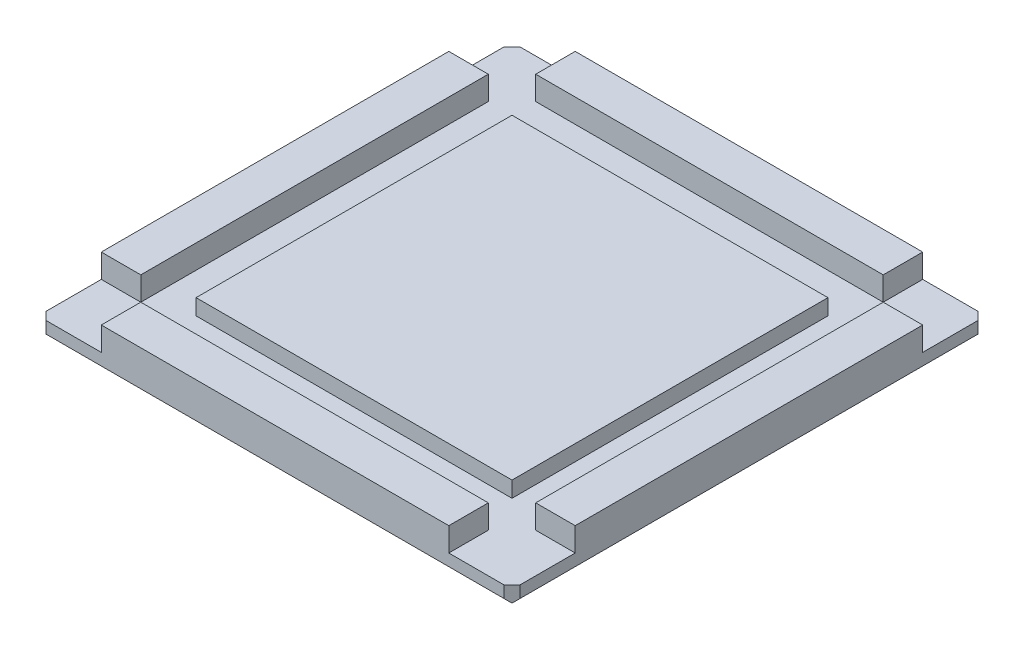
ISO-10303-21;
HEADER;
FILE_DESCRIPTION(('STEP AP214'),'2;1');
FILE_NAME('part.step','',(''),(''),'','','');
FILE_SCHEMA(('AUTOMOTIVE_DESIGN { 1 0 10303 214 1 1 1 1 }'));
ENDSEC;
DATA;
#1=APPLICATION_CONTEXT('core data for automotive mechanical design processes');
#2=APPLICATION_PROTOCOL_DEFINITION('international standard','automotive_design',2000,#1);
#3=PRODUCT_CONTEXT('',#1,'mechanical');
#4=PRODUCT('Part','Part','',(#3));
#5=PRODUCT_RELATED_PRODUCT_CATEGORY('part','',(#4));
#6=PRODUCT_DEFINITION_FORMATION('','',#4);
#7=PRODUCT_DEFINITION_CONTEXT('part definition',#1,'design');
#8=PRODUCT_DEFINITION('design','',#6,#7);
#9=PRODUCT_DEFINITION_SHAPE('','',#8);
#10=(LENGTH_UNIT() NAMED_UNIT(*) SI_UNIT(.MILLI.,.METRE.));
#11=(NAMED_UNIT(*) PLANE_ANGLE_UNIT() SI_UNIT($,.RADIAN.));
#12=(NAMED_UNIT(*) SI_UNIT($,.STERADIAN.) SOLID_ANGLE_UNIT());
#13=UNCERTAINTY_MEASURE_WITH_UNIT(LENGTH_MEASURE(1.E-05),#10,'distance_accuracy_value','');
#14=(GEOMETRIC_REPRESENTATION_CONTEXT(3) GLOBAL_UNCERTAINTY_ASSIGNED_CONTEXT((#13)) GLOBAL_UNIT_ASSIGNED_CONTEXT((#10,
#11,#12)) REPRESENTATION_CONTEXT('',''));
#15=CARTESIAN_POINT('',(0.,0.,0.));
#16=DIRECTION('',(0.,0.,1.));
#17=DIRECTION('',(1.,0.,0.));
#18=AXIS2_PLACEMENT_3D('',#15,#16,#17);
#19=CARTESIAN_POINT('',(0.,0.2,0.));
#20=DIRECTION('',(0.,1.,0.));
#21=DIRECTION('',(0.,0.,1.));
#22=AXIS2_PLACEMENT_3D('',#19,#20,#21);
#23=PLANE('',#22);
#24=DIRECTION('',(-1.,0.,0.));
#25=VECTOR('',#24,1.);
#26=CARTESIAN_POINT('',(-2.,0.2,-2.));
#27=LINE('',#26,#25);
#28=CARTESIAN_POINT('',(2.,0.2,-2.));
#29=VERTEX_POINT('',#28);
#30=CARTESIAN_POINT('',(-2.,0.2,-2.));
#31=VERTEX_POINT('',#30);
#32=EDGE_CURVE('E367',#29,#31,#27,.T.);
#33=ORIENTED_EDGE('',*,*,#32,.F.);
#34=DIRECTION('',(0.,0.,-1.));
#35=VECTOR('',#34,1.);
#36=CARTESIAN_POINT('',(2.,0.2,-2.));
#37=LINE('',#36,#35);
#38=CARTESIAN_POINT('',(2.,0.2,2.));
#39=VERTEX_POINT('',#38);
#40=EDGE_CURVE('E353',#39,#29,#37,.T.);
#41=ORIENTED_EDGE('',*,*,#40,.F.);
#42=DIRECTION('',(1.,0.,0.));
#43=VECTOR('',#42,1.);
#44=CARTESIAN_POINT('',(-2.,0.2,2.));
#45=LINE('',#44,#43);
#46=CARTESIAN_POINT('',(-2.,0.2,2.));
#47=VERTEX_POINT('',#46);
#48=EDGE_CURVE('E358',#47,#39,#45,.T.);
#49=ORIENTED_EDGE('',*,*,#48,.F.);
#50=DIRECTION('',(0.,0.,1.));
#51=VECTOR('',#50,1.);
#52=CARTESIAN_POINT('',(-2.,0.2,-2.));
#53=LINE('',#52,#51);
#54=EDGE_CURVE('E369',#31,#47,#53,.T.);
#55=ORIENTED_EDGE('',*,*,#54,.F.);
#56=EDGE_LOOP('',(#33,#41,#49,#55));
#57=FACE_BOUND('',#56,.T.);
#58=DIRECTION('',(1.,0.,0.));
#59=VECTOR('',#58,1.);
#60=CARTESIAN_POINT('',(-3.,0.2,3.));
#61=LINE('',#60,#59);
#62=CARTESIAN_POINT('',(2.2,0.2,3.));
#63=VERTEX_POINT('',#62);
#64=CARTESIAN_POINT('',(2.9,0.2,3.));
#65=VERTEX_POINT('',#64);
#66=EDGE_CURVE('E391',#63,#65,#61,.T.);
#67=ORIENTED_EDGE('',*,*,#66,.T.);
#68=DIRECTION('',(-0.707106781186548,0.,0.707106781186548));
#69=VECTOR('',#68,1.);
#70=CARTESIAN_POINT('',(2.95,0.2,2.95));
#71=LINE('',#70,#69);
#72=CARTESIAN_POINT('',(3.,0.2,2.9));
#73=VERTEX_POINT('',#72);
#74=EDGE_CURVE('E441',#65,#73,#71,.F.);
#75=ORIENTED_EDGE('',*,*,#74,.T.);
#76=DIRECTION('',(0.,0.,-1.));
#77=VECTOR('',#76,1.);
#78=CARTESIAN_POINT('',(3.,0.2,-3.));
#79=LINE('',#78,#77);
#80=CARTESIAN_POINT('',(3.,0.2,2.2));
#81=VERTEX_POINT('',#80);
#82=EDGE_CURVE('E383',#73,#81,#79,.T.);
#83=ORIENTED_EDGE('',*,*,#82,.T.);
#84=DIRECTION('',(1.,0.,0.));
#85=VECTOR('',#84,1.);
#86=CARTESIAN_POINT('',(3.,0.2,2.2));
#87=LINE('',#86,#85);
#88=CARTESIAN_POINT('',(2.5,0.2,2.2));
#89=VERTEX_POINT('',#88);
#90=EDGE_CURVE('E271',#89,#81,#87,.T.);
#91=ORIENTED_EDGE('',*,*,#90,.F.);
#92=DIRECTION('',(0.,0.,1.));
#93=VECTOR('',#92,1.);
#94=CARTESIAN_POINT('',(2.5,0.2,2.2));
#95=LINE('',#94,#93);
#96=CARTESIAN_POINT('',(2.5,0.2,-2.2));
#97=VERTEX_POINT('',#96);
#98=EDGE_CURVE('E261',#97,#89,#95,.T.);
#99=ORIENTED_EDGE('',*,*,#98,.F.);
#100=DIRECTION('',(-1.,0.,0.));
#101=VECTOR('',#100,1.);
#102=CARTESIAN_POINT('',(3.,0.2,-2.2));
#103=LINE('',#102,#101);
#104=CARTESIAN_POINT('',(3.,0.2,-2.2));
#105=VERTEX_POINT('',#104);
#106=EDGE_CURVE('E258',#105,#97,#103,.T.);
#107=ORIENTED_EDGE('',*,*,#106,.F.);
#108=CARTESIAN_POINT('',(3.,0.2,-2.9));
#109=VERTEX_POINT('',#108);
#110=EDGE_CURVE('E382',#105,#109,#79,.T.);
#111=ORIENTED_EDGE('',*,*,#110,.T.);
#112=DIRECTION('',(0.707106781186544,0.,0.707106781186551));
#113=VECTOR('',#112,1.);
#114=CARTESIAN_POINT('',(2.95000000000001,0.2,-2.94999999999999));
#115=LINE('',#114,#113);
#116=CARTESIAN_POINT('',(2.9,0.2,-3.));
#117=VERTEX_POINT('',#116);
#118=EDGE_CURVE('E439',#109,#117,#115,.F.);
#119=ORIENTED_EDGE('',*,*,#118,.T.);
#120=DIRECTION('',(-1.,0.,0.));
#121=VECTOR('',#120,1.);
#122=CARTESIAN_POINT('',(-3.,0.2,-3.));
#123=LINE('',#122,#121);
#124=CARTESIAN_POINT('',(2.2,0.2,-3.));
#125=VERTEX_POINT('',#124);
#126=EDGE_CURVE('E386',#117,#125,#123,.T.);
#127=ORIENTED_EDGE('',*,*,#126,.T.);
#128=DIRECTION('',(0.,0.,-1.));
#129=VECTOR('',#128,1.);
#130=CARTESIAN_POINT('',(2.2,0.2,-3.));
#131=LINE('',#130,#129);
#132=CARTESIAN_POINT('',(2.2,0.2,-2.5));
#133=VERTEX_POINT('',#132);
#134=EDGE_CURVE('E257',#133,#125,#131,.T.);
#135=ORIENTED_EDGE('',*,*,#134,.F.);
#136=DIRECTION('',(1.,0.,0.));
#137=VECTOR('',#136,1.);
#138=CARTESIAN_POINT('',(2.2,0.2,-2.5));
#139=LINE('',#138,#137);
#140=CARTESIAN_POINT('',(-2.2,0.2,-2.5));
#141=VERTEX_POINT('',#140);
#142=EDGE_CURVE('E254',#141,#133,#139,.T.);
#143=ORIENTED_EDGE('',*,*,#142,.F.);
#144=DIRECTION('',(0.,0.,1.));
#145=VECTOR('',#144,1.);
#146=CARTESIAN_POINT('',(-2.2,0.2,-3.));
#147=LINE('',#146,#145);
#148=CARTESIAN_POINT('',(-2.2,0.2,-3.));
#149=VERTEX_POINT('',#148);
#150=EDGE_CURVE('E477',#149,#141,#147,.T.);
#151=ORIENTED_EDGE('',*,*,#150,.F.);
#152=CARTESIAN_POINT('',(-2.9,0.2,-3.));
#153=VERTEX_POINT('',#152);
#154=EDGE_CURVE('E385',#149,#153,#123,.T.);
#155=ORIENTED_EDGE('',*,*,#154,.T.);
#156=DIRECTION('',(0.707106781186551,0.,-0.707106781186544));
#157=VECTOR('',#156,1.);
#158=CARTESIAN_POINT('',(-2.94999999999999,0.2,-2.95000000000001));
#159=LINE('',#158,#157);
#160=CARTESIAN_POINT('',(-3.,0.2,-2.9));
#161=VERTEX_POINT('',#160);
#162=EDGE_CURVE('E437',#153,#161,#159,.F.);
#163=ORIENTED_EDGE('',*,*,#162,.T.);
#164=DIRECTION('',(0.,0.,1.));
#165=VECTOR('',#164,1.);
#166=CARTESIAN_POINT('',(-3.,0.2,-3.));
#167=LINE('',#166,#165);
#168=CARTESIAN_POINT('',(-3.,0.2,-2.2));
#169=VERTEX_POINT('',#168);
#170=EDGE_CURVE('E389',#161,#169,#167,.T.);
#171=ORIENTED_EDGE('',*,*,#170,.T.);
#172=DIRECTION('',(-1.,0.,0.));
#173=VECTOR('',#172,1.);
#174=CARTESIAN_POINT('',(-3.,0.2,-2.2));
#175=LINE('',#174,#173);
#176=CARTESIAN_POINT('',(-2.5,0.2,-2.2));
#177=VERTEX_POINT('',#176);
#178=EDGE_CURVE('E328',#177,#169,#175,.T.);
#179=ORIENTED_EDGE('',*,*,#178,.F.);
#180=DIRECTION('',(0.,0.,-1.));
#181=VECTOR('',#180,1.);
#182=CARTESIAN_POINT('',(-2.5,0.2,-2.2));
#183=LINE('',#182,#181);
#184=CARTESIAN_POINT('',(-2.5,0.2,2.2));
#185=VERTEX_POINT('',#184);
#186=EDGE_CURVE('E337',#185,#177,#183,.T.);
#187=ORIENTED_EDGE('',*,*,#186,.F.);
#188=DIRECTION('',(1.,0.,0.));
#189=VECTOR('',#188,1.);
#190=CARTESIAN_POINT('',(-3.,0.2,2.2));
#191=LINE('',#190,#189);
#192=CARTESIAN_POINT('',(-3.,0.2,2.2));
#193=VERTEX_POINT('',#192);
#194=EDGE_CURVE('E323',#193,#185,#191,.T.);
#195=ORIENTED_EDGE('',*,*,#194,.F.);
#196=CARTESIAN_POINT('',(-3.,0.2,2.9));
#197=VERTEX_POINT('',#196);
#198=EDGE_CURVE('E388',#193,#197,#167,.T.);
#199=ORIENTED_EDGE('',*,*,#198,.T.);
#200=DIRECTION('',(-0.707106781186544,0.,-0.707106781186551));
#201=VECTOR('',#200,1.);
#202=CARTESIAN_POINT('',(-2.95000000000001,0.2,2.94999999999999));
#203=LINE('',#202,#201);
#204=CARTESIAN_POINT('',(-2.9,0.2,3.));
#205=VERTEX_POINT('',#204);
#206=EDGE_CURVE('E435',#197,#205,#203,.F.);
#207=ORIENTED_EDGE('',*,*,#206,.T.);
#208=CARTESIAN_POINT('',(-2.2,0.2,3.));
#209=VERTEX_POINT('',#208);
#210=EDGE_CURVE('E392',#205,#209,#61,.T.);
#211=ORIENTED_EDGE('',*,*,#210,.T.);
#212=DIRECTION('',(0.,0.,1.));
#213=VECTOR('',#212,1.);
#214=CARTESIAN_POINT('',(-2.2,0.2,3.));
#215=LINE('',#214,#213);
#216=CARTESIAN_POINT('',(-2.2,0.2,2.5));
#217=VERTEX_POINT('',#216);
#218=EDGE_CURVE('E293',#217,#209,#215,.T.);
#219=ORIENTED_EDGE('',*,*,#218,.F.);
#220=DIRECTION('',(-1.,0.,0.));
#221=VECTOR('',#220,1.);
#222=CARTESIAN_POINT('',(-2.2,0.2,2.5));
#223=LINE('',#222,#221);
#224=CARTESIAN_POINT('',(2.2,0.2,2.5));
#225=VERTEX_POINT('',#224);
#226=EDGE_CURVE('E298',#225,#217,#223,.T.);
#227=ORIENTED_EDGE('',*,*,#226,.F.);
#228=DIRECTION('',(0.,0.,-1.));
#229=VECTOR('',#228,1.);
#230=CARTESIAN_POINT('',(2.2,0.2,3.));
#231=LINE('',#230,#229);
#232=EDGE_CURVE('E307',#63,#225,#231,.T.);
#233=ORIENTED_EDGE('',*,*,#232,.F.);
#234=EDGE_LOOP('',(#67,#75,#83,#91,#99,#107,#111,#119,#127,#135,#143,#151,#155,#163,#171,#179,
#187,#195,#199,#207,#211,#219,#227,#233));
#235=FACE_BOUND('',#234,.T.);
#236=ADVANCED_FACE('F36',(#57,#235),#23,.T.);
#237=CARTESIAN_POINT('',(3.,0.2,-3.));
#238=DIRECTION('',(-1.,0.,0.));
#239=DIRECTION('',(0.,0.,1.));
#240=AXIS2_PLACEMENT_3D('',#237,#238,#239);
#241=PLANE('',#240);
#242=ORIENTED_EDGE('',*,*,#82,.F.);
#243=DIRECTION('',(0.,-1.,0.));
#244=VECTOR('',#243,1.);
#245=CARTESIAN_POINT('',(3.,0.2,2.9));
#246=LINE('',#245,#244);
#247=CARTESIAN_POINT('',(3.,0.0499999999999997,2.9));
#248=VERTEX_POINT('',#247);
#249=EDGE_CURVE('E419',#73,#248,#246,.T.);
#250=ORIENTED_EDGE('',*,*,#249,.T.);
#251=DIRECTION('',(0.,0.,-1.));
#252=VECTOR('',#251,1.);
#253=CARTESIAN_POINT('',(3.,0.0499999999999997,-3.));
#254=LINE('',#253,#252);
#255=CARTESIAN_POINT('',(3.,0.0499999999999997,-2.9));
#256=VERTEX_POINT('',#255);
#257=EDGE_CURVE('E414',#248,#256,#254,.T.);
#258=ORIENTED_EDGE('',*,*,#257,.T.);
#259=DIRECTION('',(0.,1.,0.));
#260=VECTOR('',#259,1.);
#261=CARTESIAN_POINT('',(3.,0.2,-2.9));
#262=LINE('',#261,#260);
#263=EDGE_CURVE('E417',#256,#109,#262,.T.);
#264=ORIENTED_EDGE('',*,*,#263,.T.);
#265=ORIENTED_EDGE('',*,*,#110,.F.);
#266=DIRECTION('',(0.,-1.,0.));
#267=VECTOR('',#266,1.);
#268=CARTESIAN_POINT('',(3.,0.5,-2.2));
#269=LINE('',#268,#267);
#270=CARTESIAN_POINT('',(3.,0.5,-2.2));
#271=VERTEX_POINT('',#270);
#272=EDGE_CURVE('E290',#271,#105,#269,.T.);
#273=ORIENTED_EDGE('',*,*,#272,.F.);
#274=DIRECTION('',(0.,0.,-1.));
#275=VECTOR('',#274,1.);
#276=CARTESIAN_POINT('',(3.,0.5,2.2));
#277=LINE('',#276,#275);
#278=CARTESIAN_POINT('',(3.,0.5,2.2));
#279=VERTEX_POINT('',#278);
#280=EDGE_CURVE('E267',#279,#271,#277,.T.);
#281=ORIENTED_EDGE('',*,*,#280,.F.);
#282=DIRECTION('',(0.,-1.,0.));
#283=VECTOR('',#282,1.);
#284=CARTESIAN_POINT('',(3.,0.5,2.2));
#285=LINE('',#284,#283);
#286=EDGE_CURVE('E276',#279,#81,#285,.T.);
#287=ORIENTED_EDGE('',*,*,#286,.T.);
#288=EDGE_LOOP('',(#242,#250,#258,#264,#265,#273,#281,#287));
#289=FACE_BOUND('',#288,.T.);
#290=ADVANCED_FACE('F502',(#289),#241,.F.);
#291=CARTESIAN_POINT('',(-3.,0.2,-3.));
#292=DIRECTION('',(0.,0.,1.));
#293=DIRECTION('',(1.,0.,0.));
#294=AXIS2_PLACEMENT_3D('',#291,#292,#293);
#295=PLANE('',#294);
#296=ORIENTED_EDGE('',*,*,#126,.F.);
#297=DIRECTION('',(0.,-1.,0.));
#298=VECTOR('',#297,1.);
#299=CARTESIAN_POINT('',(2.9,0.2,-3.));
#300=LINE('',#299,#298);
#301=CARTESIAN_POINT('',(2.9,0.0499999999999997,-3.));
#302=VERTEX_POINT('',#301);
#303=EDGE_CURVE('E445',#117,#302,#300,.T.);
#304=ORIENTED_EDGE('',*,*,#303,.T.);
#305=DIRECTION('',(-1.,0.,0.));
#306=VECTOR('',#305,1.);
#307=CARTESIAN_POINT('',(-3.,0.0499999999999997,-3.));
#308=LINE('',#307,#306);
#309=CARTESIAN_POINT('',(-2.9,0.0499999999999997,-3.));
#310=VERTEX_POINT('',#309);
#311=EDGE_CURVE('E394',#302,#310,#308,.T.);
#312=ORIENTED_EDGE('',*,*,#311,.T.);
#313=DIRECTION('',(0.,1.,0.));
#314=VECTOR('',#313,1.);
#315=CARTESIAN_POINT('',(-2.9,0.2,-3.));
#316=LINE('',#315,#314);
#317=EDGE_CURVE('E443',#310,#153,#316,.T.);
#318=ORIENTED_EDGE('',*,*,#317,.T.);
#319=ORIENTED_EDGE('',*,*,#154,.F.);
#320=DIRECTION('',(0.,-1.,0.));
#321=VECTOR('',#320,1.);
#322=CARTESIAN_POINT('',(-2.2,0.5,-3.));
#323=LINE('',#322,#321);
#324=CARTESIAN_POINT('',(-2.2,0.5,-3.));
#325=VERTEX_POINT('',#324);
#326=EDGE_CURVE('E241',#325,#149,#323,.T.);
#327=ORIENTED_EDGE('',*,*,#326,.F.);
#328=DIRECTION('',(-1.,0.,0.));
#329=VECTOR('',#328,1.);
#330=CARTESIAN_POINT('',(2.2,0.5,-3.));
#331=LINE('',#330,#329);
#332=CARTESIAN_POINT('',(2.2,0.5,-3.));
#333=VERTEX_POINT('',#332);
#334=EDGE_CURVE('E233',#333,#325,#331,.T.);
#335=ORIENTED_EDGE('',*,*,#334,.F.);
#336=DIRECTION('',(0.,-1.,0.));
#337=VECTOR('',#336,1.);
#338=CARTESIAN_POINT('',(2.2,0.5,-3.));
#339=LINE('',#338,#337);
#340=EDGE_CURVE('E238',#333,#125,#339,.T.);
#341=ORIENTED_EDGE('',*,*,#340,.T.);
#342=EDGE_LOOP('',(#296,#304,#312,#318,#319,#327,#335,#341));
#343=FACE_BOUND('',#342,.T.);
#344=ADVANCED_FACE('F236',(#343),#295,.F.);
#345=CARTESIAN_POINT('',(-3.,0.2,-3.));
#346=DIRECTION('',(1.,0.,0.));
#347=DIRECTION('',(0.,0.,-1.));
#348=AXIS2_PLACEMENT_3D('',#345,#346,#347);
#349=PLANE('',#348);
#350=ORIENTED_EDGE('',*,*,#170,.F.);
#351=DIRECTION('',(0.,-1.,0.));
#352=VECTOR('',#351,1.);
#353=CARTESIAN_POINT('',(-3.,0.2,-2.9));
#354=LINE('',#353,#352);
#355=CARTESIAN_POINT('',(-3.,0.0499999999999997,-2.9));
#356=VERTEX_POINT('',#355);
#357=EDGE_CURVE('E454',#161,#356,#354,.T.);
#358=ORIENTED_EDGE('',*,*,#357,.T.);
#359=DIRECTION('',(0.,0.,1.));
#360=VECTOR('',#359,1.);
#361=CARTESIAN_POINT('',(-3.,0.0499999999999997,-3.));
#362=LINE('',#361,#360);
#363=CARTESIAN_POINT('',(-3.,0.0499999999999997,2.9));
#364=VERTEX_POINT('',#363);
#365=EDGE_CURVE('E409',#356,#364,#362,.T.);
#366=ORIENTED_EDGE('',*,*,#365,.T.);
#367=DIRECTION('',(0.,1.,0.));
#368=VECTOR('',#367,1.);
#369=CARTESIAN_POINT('',(-3.,0.2,2.9));
#370=LINE('',#369,#368);
#371=EDGE_CURVE('E452',#364,#197,#370,.T.);
#372=ORIENTED_EDGE('',*,*,#371,.T.);
#373=ORIENTED_EDGE('',*,*,#198,.F.);
#374=DIRECTION('',(0.,-1.,0.));
#375=VECTOR('',#374,1.);
#376=CARTESIAN_POINT('',(-3.,0.5,2.2));
#377=LINE('',#376,#375);
#378=CARTESIAN_POINT('',(-3.,0.5,2.2));
#379=VERTEX_POINT('',#378);
#380=EDGE_CURVE('E350',#379,#193,#377,.T.);
#381=ORIENTED_EDGE('',*,*,#380,.F.);
#382=DIRECTION('',(0.,0.,1.));
#383=VECTOR('',#382,1.);
#384=CARTESIAN_POINT('',(-3.,0.5,-2.2));
#385=LINE('',#384,#383);
#386=CARTESIAN_POINT('',(-3.,0.5,-2.2));
#387=VERTEX_POINT('',#386);
#388=EDGE_CURVE('E324',#387,#379,#385,.T.);
#389=ORIENTED_EDGE('',*,*,#388,.F.);
#390=DIRECTION('',(0.,-1.,0.));
#391=VECTOR('',#390,1.);
#392=CARTESIAN_POINT('',(-3.,0.5,-2.2));
#393=LINE('',#392,#391);
#394=EDGE_CURVE('E334',#387,#169,#393,.T.);
#395=ORIENTED_EDGE('',*,*,#394,.T.);
#396=EDGE_LOOP('',(#350,#358,#366,#372,#373,#381,#389,#395));
#397=FACE_BOUND('',#396,.T.);
#398=ADVANCED_FACE('F457',(#397),#349,.F.);
#399=CARTESIAN_POINT('',(-3.,0.2,3.));
#400=DIRECTION('',(0.,0.,-1.));
#401=DIRECTION('',(-1.,0.,0.));
#402=AXIS2_PLACEMENT_3D('',#399,#400,#401);
#403=PLANE('',#402);
#404=DIRECTION('',(1.,0.,0.));
#405=VECTOR('',#404,1.);
#406=CARTESIAN_POINT('',(-3.,0.0499999999999997,3.));
#407=LINE('',#406,#405);
#408=CARTESIAN_POINT('',(-2.9,0.0499999999999997,3.));
#409=VERTEX_POINT('',#408);
#410=CARTESIAN_POINT('',(2.9,0.0499999999999997,3.));
#411=VERTEX_POINT('',#410);
#412=EDGE_CURVE('E411',#409,#411,#407,.T.);
#413=ORIENTED_EDGE('',*,*,#412,.T.);
#414=DIRECTION('',(0.,1.,0.));
#415=VECTOR('',#414,1.);
#416=CARTESIAN_POINT('',(2.9,0.2,3.));
#417=LINE('',#416,#415);
#418=EDGE_CURVE('E433',#411,#65,#417,.T.);
#419=ORIENTED_EDGE('',*,*,#418,.T.);
#420=ORIENTED_EDGE('',*,*,#66,.F.);
#421=DIRECTION('',(0.,-1.,0.));
#422=VECTOR('',#421,1.);
#423=CARTESIAN_POINT('',(2.2,0.5,3.));
#424=LINE('',#423,#422);
#425=CARTESIAN_POINT('',(2.2,0.5,3.));
#426=VERTEX_POINT('',#425);
#427=EDGE_CURVE('E317',#426,#63,#424,.T.);
#428=ORIENTED_EDGE('',*,*,#427,.F.);
#429=DIRECTION('',(1.,0.,0.));
#430=VECTOR('',#429,1.);
#431=CARTESIAN_POINT('',(-2.2,0.5,3.));
#432=LINE('',#431,#430);
#433=CARTESIAN_POINT('',(-2.2,0.5,3.));
#434=VERTEX_POINT('',#433);
#435=EDGE_CURVE('E297',#434,#426,#432,.T.);
#436=ORIENTED_EDGE('',*,*,#435,.F.);
#437=DIRECTION('',(0.,-1.,0.));
#438=VECTOR('',#437,1.);
#439=CARTESIAN_POINT('',(-2.2,0.5,3.));
#440=LINE('',#439,#438);
#441=EDGE_CURVE('E320',#434,#209,#440,.T.);
#442=ORIENTED_EDGE('',*,*,#441,.T.);
#443=ORIENTED_EDGE('',*,*,#210,.F.);
#444=DIRECTION('',(0.,-1.,0.));
#445=VECTOR('',#444,1.);
#446=CARTESIAN_POINT('',(-2.9,0.2,3.));
#447=LINE('',#446,#445);
#448=EDGE_CURVE('E430',#205,#409,#447,.T.);
#449=ORIENTED_EDGE('',*,*,#448,.T.);
#450=EDGE_LOOP('',(#413,#419,#420,#428,#436,#442,#443,#449));
#451=FACE_BOUND('',#450,.T.);
#452=ADVANCED_FACE('F517',(#451),#403,.F.);
#453=CARTESIAN_POINT('',(0.,0.,0.));
#454=DIRECTION('',(0.,1.,0.));
#455=DIRECTION('',(0.,0.,1.));
#456=AXIS2_PLACEMENT_3D('',#453,#454,#455);
#457=PLANE('',#456);
#458=DIRECTION('',(0.,0.,-1.));
#459=VECTOR('',#458,1.);
#460=CARTESIAN_POINT('',(-2.95,0.,0.));
#461=LINE('',#460,#459);
#462=CARTESIAN_POINT('',(-2.95,0.,2.95));
#463=VERTEX_POINT('',#462);
#464=CARTESIAN_POINT('',(-2.95,0.,-2.95));
#465=VERTEX_POINT('',#464);
#466=EDGE_CURVE('E403',#463,#465,#461,.T.);
#467=ORIENTED_EDGE('',*,*,#466,.T.);
#468=DIRECTION('',(1.,0.,0.));
#469=VECTOR('',#468,1.);
#470=CARTESIAN_POINT('',(0.,0.,-2.95));
#471=LINE('',#470,#469);
#472=CARTESIAN_POINT('',(2.95,0.,-2.95));
#473=VERTEX_POINT('',#472);
#474=EDGE_CURVE('E406',#465,#473,#471,.T.);
#475=ORIENTED_EDGE('',*,*,#474,.T.);
#476=DIRECTION('',(0.,0.,1.));
#477=VECTOR('',#476,1.);
#478=CARTESIAN_POINT('',(2.95,0.,0.));
#479=LINE('',#478,#477);
#480=CARTESIAN_POINT('',(2.95,0.,2.95));
#481=VERTEX_POINT('',#480);
#482=EDGE_CURVE('E397',#473,#481,#479,.T.);
#483=ORIENTED_EDGE('',*,*,#482,.T.);
#484=DIRECTION('',(-1.,0.,0.));
#485=VECTOR('',#484,1.);
#486=CARTESIAN_POINT('',(0.,0.,2.95));
#487=LINE('',#486,#485);
#488=EDGE_CURVE('E400',#481,#463,#487,.T.);
#489=ORIENTED_EDGE('',*,*,#488,.T.);
#490=EDGE_LOOP('',(#467,#475,#483,#489));
#491=FACE_BOUND('',#490,.T.);
#492=ADVANCED_FACE('F463',(#491),#457,.F.);
#493=CARTESIAN_POINT('',(2.,0.4,-2.));
#494=DIRECTION('',(-1.,0.,0.));
#495=DIRECTION('',(0.,0.,1.));
#496=AXIS2_PLACEMENT_3D('',#493,#494,#495);
#497=PLANE('',#496);
#498=ORIENTED_EDGE('',*,*,#40,.T.);
#499=DIRECTION('',(0.,-1.,0.));
#500=VECTOR('',#499,1.);
#501=CARTESIAN_POINT('',(2.,0.4,-2.));
#502=LINE('',#501,#500);
#503=CARTESIAN_POINT('',(2.,0.4,-2.));
#504=VERTEX_POINT('',#503);
#505=EDGE_CURVE('E380',#504,#29,#502,.T.);
#506=ORIENTED_EDGE('',*,*,#505,.F.);
#507=DIRECTION('',(0.,0.,-1.));
#508=VECTOR('',#507,1.);
#509=CARTESIAN_POINT('',(2.,0.4,-2.));
#510=LINE('',#509,#508);
#511=CARTESIAN_POINT('',(2.,0.4,2.));
#512=VERTEX_POINT('',#511);
#513=EDGE_CURVE('E354',#512,#504,#510,.T.);
#514=ORIENTED_EDGE('',*,*,#513,.F.);
#515=DIRECTION('',(0.,-1.,0.));
#516=VECTOR('',#515,1.);
#517=CARTESIAN_POINT('',(2.,0.4,2.));
#518=LINE('',#517,#516);
#519=EDGE_CURVE('E364',#512,#39,#518,.T.);
#520=ORIENTED_EDGE('',*,*,#519,.T.);
#521=EDGE_LOOP('',(#498,#506,#514,#520));
#522=FACE_BOUND('',#521,.T.);
#523=ADVANCED_FACE('F513',(#522),#497,.F.);
#524=CARTESIAN_POINT('',(-2.,0.4,-2.));
#525=DIRECTION('',(0.,0.,1.));
#526=DIRECTION('',(1.,0.,0.));
#527=AXIS2_PLACEMENT_3D('',#524,#525,#526);
#528=PLANE('',#527);
#529=ORIENTED_EDGE('',*,*,#32,.T.);
#530=DIRECTION('',(0.,-1.,0.));
#531=VECTOR('',#530,1.);
#532=CARTESIAN_POINT('',(-2.,0.4,-2.));
#533=LINE('',#532,#531);
#534=CARTESIAN_POINT('',(-2.,0.4,-2.));
#535=VERTEX_POINT('',#534);
#536=EDGE_CURVE('E377',#535,#31,#533,.T.);
#537=ORIENTED_EDGE('',*,*,#536,.F.);
#538=DIRECTION('',(-1.,0.,0.));
#539=VECTOR('',#538,1.);
#540=CARTESIAN_POINT('',(-2.,0.4,-2.));
#541=LINE('',#540,#539);
#542=EDGE_CURVE('E357',#504,#535,#541,.T.);
#543=ORIENTED_EDGE('',*,*,#542,.F.);
#544=ORIENTED_EDGE('',*,*,#505,.T.);
#545=EDGE_LOOP('',(#529,#537,#543,#544));
#546=FACE_BOUND('',#545,.T.);
#547=ADVANCED_FACE('F642',(#546),#528,.F.);
#548=CARTESIAN_POINT('',(-2.,0.4,-2.));
#549=DIRECTION('',(1.,0.,0.));
#550=DIRECTION('',(0.,0.,-1.));
#551=AXIS2_PLACEMENT_3D('',#548,#549,#550);
#552=PLANE('',#551);
#553=ORIENTED_EDGE('',*,*,#54,.T.);
#554=DIRECTION('',(0.,-1.,0.));
#555=VECTOR('',#554,1.);
#556=CARTESIAN_POINT('',(-2.,0.4,2.));
#557=LINE('',#556,#555);
#558=CARTESIAN_POINT('',(-2.,0.4,2.));
#559=VERTEX_POINT('',#558);
#560=EDGE_CURVE('E375',#559,#47,#557,.T.);
#561=ORIENTED_EDGE('',*,*,#560,.F.);
#562=DIRECTION('',(0.,0.,1.));
#563=VECTOR('',#562,1.);
#564=CARTESIAN_POINT('',(-2.,0.4,-2.));
#565=LINE('',#564,#563);
#566=EDGE_CURVE('E360',#535,#559,#565,.T.);
#567=ORIENTED_EDGE('',*,*,#566,.F.);
#568=ORIENTED_EDGE('',*,*,#536,.T.);
#569=EDGE_LOOP('',(#553,#561,#567,#568));
#570=FACE_BOUND('',#569,.T.);
#571=ADVANCED_FACE('F639',(#570),#552,.F.);
#572=CARTESIAN_POINT('',(-2.,0.4,2.));
#573=DIRECTION('',(0.,0.,-1.));
#574=DIRECTION('',(-1.,0.,0.));
#575=AXIS2_PLACEMENT_3D('',#572,#573,#574);
#576=PLANE('',#575);
#577=ORIENTED_EDGE('',*,*,#48,.T.);
#578=ORIENTED_EDGE('',*,*,#519,.F.);
#579=DIRECTION('',(1.,0.,0.));
#580=VECTOR('',#579,1.);
#581=CARTESIAN_POINT('',(-2.,0.4,2.));
#582=LINE('',#581,#580);
#583=EDGE_CURVE('E362',#559,#512,#582,.T.);
#584=ORIENTED_EDGE('',*,*,#583,.F.);
#585=ORIENTED_EDGE('',*,*,#560,.T.);
#586=EDGE_LOOP('',(#577,#578,#584,#585));
#587=FACE_BOUND('',#586,.T.);
#588=ADVANCED_FACE('F635',(#587),#576,.F.);
#589=CARTESIAN_POINT('',(0.,0.4,0.));
#590=DIRECTION('',(0.,1.,0.));
#591=DIRECTION('',(0.,0.,1.));
#592=AXIS2_PLACEMENT_3D('',#589,#590,#591);
#593=PLANE('',#592);
#594=ORIENTED_EDGE('',*,*,#513,.T.);
#595=ORIENTED_EDGE('',*,*,#542,.T.);
#596=ORIENTED_EDGE('',*,*,#566,.T.);
#597=ORIENTED_EDGE('',*,*,#583,.T.);
#598=EDGE_LOOP('',(#594,#595,#596,#597));
#599=FACE_BOUND('',#598,.T.);
#600=ADVANCED_FACE('F631',(#599),#593,.T.);
#601=CARTESIAN_POINT('',(-3.,0.5,2.2));
#602=DIRECTION('',(0.,0.,-1.));
#603=DIRECTION('',(-1.,0.,0.));
#604=AXIS2_PLACEMENT_3D('',#601,#602,#603);
#605=PLANE('',#604);
#606=ORIENTED_EDGE('',*,*,#194,.T.);
#607=DIRECTION('',(0.,-1.,0.));
#608=VECTOR('',#607,1.);
#609=CARTESIAN_POINT('',(-2.5,0.5,2.2));
#610=LINE('',#609,#608);
#611=CARTESIAN_POINT('',(-2.5,0.5,2.2));
#612=VERTEX_POINT('',#611);
#613=EDGE_CURVE('E347',#612,#185,#610,.T.);
#614=ORIENTED_EDGE('',*,*,#613,.F.);
#615=DIRECTION('',(1.,0.,0.));
#616=VECTOR('',#615,1.);
#617=CARTESIAN_POINT('',(-3.,0.5,2.2));
#618=LINE('',#617,#616);
#619=EDGE_CURVE('E327',#379,#612,#618,.T.);
#620=ORIENTED_EDGE('',*,*,#619,.F.);
#621=ORIENTED_EDGE('',*,*,#380,.T.);
#622=EDGE_LOOP('',(#606,#614,#620,#621));
#623=FACE_BOUND('',#622,.T.);
#624=ADVANCED_FACE('F627',(#623),#605,.F.);
#625=CARTESIAN_POINT('',(-2.5,0.5,-2.2));
#626=DIRECTION('',(-1.,0.,0.));
#627=DIRECTION('',(0.,0.,1.));
#628=AXIS2_PLACEMENT_3D('',#625,#626,#627);
#629=PLANE('',#628);
#630=ORIENTED_EDGE('',*,*,#186,.T.);
#631=DIRECTION('',(0.,-1.,0.));
#632=VECTOR('',#631,1.);
#633=CARTESIAN_POINT('',(-2.5,0.5,-2.2));
#634=LINE('',#633,#632);
#635=CARTESIAN_POINT('',(-2.5,0.5,-2.2));
#636=VERTEX_POINT('',#635);
#637=EDGE_CURVE('E344',#636,#177,#634,.T.);
#638=ORIENTED_EDGE('',*,*,#637,.F.);
#639=DIRECTION('',(0.,0.,-1.));
#640=VECTOR('',#639,1.);
#641=CARTESIAN_POINT('',(-2.5,0.5,-2.2));
#642=LINE('',#641,#640);
#643=EDGE_CURVE('E330',#612,#636,#642,.T.);
#644=ORIENTED_EDGE('',*,*,#643,.F.);
#645=ORIENTED_EDGE('',*,*,#613,.T.);
#646=EDGE_LOOP('',(#630,#638,#644,#645));
#647=FACE_BOUND('',#646,.T.);
#648=ADVANCED_FACE('F623',(#647),#629,.F.);
#649=CARTESIAN_POINT('',(-3.,0.5,-2.2));
#650=DIRECTION('',(0.,0.,1.));
#651=DIRECTION('',(1.,0.,0.));
#652=AXIS2_PLACEMENT_3D('',#649,#650,#651);
#653=PLANE('',#652);
#654=ORIENTED_EDGE('',*,*,#178,.T.);
#655=ORIENTED_EDGE('',*,*,#394,.F.);
#656=DIRECTION('',(-1.,0.,0.));
#657=VECTOR('',#656,1.);
#658=CARTESIAN_POINT('',(-3.,0.5,-2.2));
#659=LINE('',#658,#657);
#660=EDGE_CURVE('E332',#636,#387,#659,.T.);
#661=ORIENTED_EDGE('',*,*,#660,.F.);
#662=ORIENTED_EDGE('',*,*,#637,.T.);
#663=EDGE_LOOP('',(#654,#655,#661,#662));
#664=FACE_BOUND('',#663,.T.);
#665=ADVANCED_FACE('F619',(#664),#653,.F.);
#666=CARTESIAN_POINT('',(0.,0.5,0.));
#667=DIRECTION('',(0.,1.,0.));
#668=DIRECTION('',(0.,0.,1.));
#669=AXIS2_PLACEMENT_3D('',#666,#667,#668);
#670=PLANE('',#669);
#671=ORIENTED_EDGE('',*,*,#388,.T.);
#672=ORIENTED_EDGE('',*,*,#619,.T.);
#673=ORIENTED_EDGE('',*,*,#643,.T.);
#674=ORIENTED_EDGE('',*,*,#660,.T.);
#675=EDGE_LOOP('',(#671,#672,#673,#674));
#676=FACE_BOUND('',#675,.T.);
#677=ADVANCED_FACE('F616',(#676),#670,.T.);
#678=CARTESIAN_POINT('',(-2.2,0.5,3.));
#679=DIRECTION('',(1.,0.,0.));
#680=DIRECTION('',(0.,0.,-1.));
#681=AXIS2_PLACEMENT_3D('',#678,#679,#680);
#682=PLANE('',#681);
#683=ORIENTED_EDGE('',*,*,#218,.T.);
#684=ORIENTED_EDGE('',*,*,#441,.F.);
#685=DIRECTION('',(0.,0.,1.));
#686=VECTOR('',#685,1.);
#687=CARTESIAN_POINT('',(-2.2,0.5,3.));
#688=LINE('',#687,#686);
#689=CARTESIAN_POINT('',(-2.2,0.5,2.5));
#690=VERTEX_POINT('',#689);
#691=EDGE_CURVE('E294',#690,#434,#688,.T.);
#692=ORIENTED_EDGE('',*,*,#691,.F.);
#693=DIRECTION('',(0.,-1.,0.));
#694=VECTOR('',#693,1.);
#695=CARTESIAN_POINT('',(-2.2,0.5,2.5));
#696=LINE('',#695,#694);
#697=EDGE_CURVE('E304',#690,#217,#696,.T.);
#698=ORIENTED_EDGE('',*,*,#697,.T.);
#699=EDGE_LOOP('',(#683,#684,#692,#698));
#700=FACE_BOUND('',#699,.T.);
#701=ADVANCED_FACE('F560',(#700),#682,.F.);
#702=CARTESIAN_POINT('',(2.2,0.5,3.));
#703=DIRECTION('',(-1.,0.,0.));
#704=DIRECTION('',(0.,0.,1.));
#705=AXIS2_PLACEMENT_3D('',#702,#703,#704);
#706=PLANE('',#705);
#707=ORIENTED_EDGE('',*,*,#232,.T.);
#708=DIRECTION('',(0.,-1.,0.));
#709=VECTOR('',#708,1.);
#710=CARTESIAN_POINT('',(2.2,0.5,2.5));
#711=LINE('',#710,#709);
#712=CARTESIAN_POINT('',(2.2,0.5,2.5));
#713=VERTEX_POINT('',#712);
#714=EDGE_CURVE('E314',#713,#225,#711,.T.);
#715=ORIENTED_EDGE('',*,*,#714,.F.);
#716=DIRECTION('',(0.,0.,-1.));
#717=VECTOR('',#716,1.);
#718=CARTESIAN_POINT('',(2.2,0.5,3.));
#719=LINE('',#718,#717);
#720=EDGE_CURVE('E300',#426,#713,#719,.T.);
#721=ORIENTED_EDGE('',*,*,#720,.F.);
#722=ORIENTED_EDGE('',*,*,#427,.T.);
#723=EDGE_LOOP('',(#707,#715,#721,#722));
#724=FACE_BOUND('',#723,.T.);
#725=ADVANCED_FACE('F569',(#724),#706,.F.);
#726=CARTESIAN_POINT('',(-2.2,0.5,2.5));
#727=DIRECTION('',(0.,0.,1.));
#728=DIRECTION('',(1.,0.,0.));
#729=AXIS2_PLACEMENT_3D('',#726,#727,#728);
#730=PLANE('',#729);
#731=ORIENTED_EDGE('',*,*,#226,.T.);
#732=ORIENTED_EDGE('',*,*,#697,.F.);
#733=DIRECTION('',(-1.,0.,0.));
#734=VECTOR('',#733,1.);
#735=CARTESIAN_POINT('',(-2.2,0.5,2.5));
#736=LINE('',#735,#734);
#737=EDGE_CURVE('E302',#713,#690,#736,.T.);
#738=ORIENTED_EDGE('',*,*,#737,.F.);
#739=ORIENTED_EDGE('',*,*,#714,.T.);
#740=EDGE_LOOP('',(#731,#732,#738,#739));
#741=FACE_BOUND('',#740,.T.);
#742=ADVANCED_FACE('F564',(#741),#730,.F.);
#743=CARTESIAN_POINT('',(0.,0.5,0.));
#744=DIRECTION('',(0.,-1.,0.));
#745=DIRECTION('',(0.,0.,-1.));
#746=AXIS2_PLACEMENT_3D('',#743,#744,#745);
#747=PLANE('',#746);
#748=ORIENTED_EDGE('',*,*,#691,.T.);
#749=ORIENTED_EDGE('',*,*,#435,.T.);
#750=ORIENTED_EDGE('',*,*,#720,.T.);
#751=ORIENTED_EDGE('',*,*,#737,.T.);
#752=EDGE_LOOP('',(#748,#749,#750,#751));
#753=FACE_BOUND('',#752,.T.);
#754=ADVANCED_FACE('F603',(#753),#747,.F.);
#755=CARTESIAN_POINT('',(3.,0.5,-2.2));
#756=DIRECTION('',(0.,0.,1.));
#757=DIRECTION('',(1.,0.,0.));
#758=AXIS2_PLACEMENT_3D('',#755,#756,#757);
#759=PLANE('',#758);
#760=ORIENTED_EDGE('',*,*,#106,.T.);
#761=DIRECTION('',(0.,-1.,0.));
#762=VECTOR('',#761,1.);
#763=CARTESIAN_POINT('',(2.5,0.5,-2.2));
#764=LINE('',#763,#762);
#765=CARTESIAN_POINT('',(2.5,0.5,-2.2));
#766=VERTEX_POINT('',#765);
#767=EDGE_CURVE('E287',#766,#97,#764,.T.);
#768=ORIENTED_EDGE('',*,*,#767,.F.);
#769=DIRECTION('',(-1.,0.,0.));
#770=VECTOR('',#769,1.);
#771=CARTESIAN_POINT('',(3.,0.5,-2.2));
#772=LINE('',#771,#770);
#773=EDGE_CURVE('E270',#271,#766,#772,.T.);
#774=ORIENTED_EDGE('',*,*,#773,.F.);
#775=ORIENTED_EDGE('',*,*,#272,.T.);
#776=EDGE_LOOP('',(#760,#768,#774,#775));
#777=FACE_BOUND('',#776,.T.);
#778=ADVANCED_FACE('F584',(#777),#759,.F.);
#779=CARTESIAN_POINT('',(2.5,0.5,2.2));
#780=DIRECTION('',(1.,0.,0.));
#781=DIRECTION('',(0.,0.,-1.));
#782=AXIS2_PLACEMENT_3D('',#779,#780,#781);
#783=PLANE('',#782);
#784=ORIENTED_EDGE('',*,*,#98,.T.);
#785=DIRECTION('',(0.,-1.,0.));
#786=VECTOR('',#785,1.);
#787=CARTESIAN_POINT('',(2.5,0.5,2.2));
#788=LINE('',#787,#786);
#789=CARTESIAN_POINT('',(2.5,0.5,2.2));
#790=VERTEX_POINT('',#789);
#791=EDGE_CURVE('E284',#790,#89,#788,.T.);
#792=ORIENTED_EDGE('',*,*,#791,.F.);
#793=DIRECTION('',(0.,0.,1.));
#794=VECTOR('',#793,1.);
#795=CARTESIAN_POINT('',(2.5,0.5,2.2));
#796=LINE('',#795,#794);
#797=EDGE_CURVE('E273',#766,#790,#796,.T.);
#798=ORIENTED_EDGE('',*,*,#797,.F.);
#799=ORIENTED_EDGE('',*,*,#767,.T.);
#800=EDGE_LOOP('',(#784,#792,#798,#799));
#801=FACE_BOUND('',#800,.T.);
#802=ADVANCED_FACE('F595',(#801),#783,.F.);
#803=CARTESIAN_POINT('',(3.,0.5,2.2));
#804=DIRECTION('',(0.,0.,-1.));
#805=DIRECTION('',(-1.,0.,0.));
#806=AXIS2_PLACEMENT_3D('',#803,#804,#805);
#807=PLANE('',#806);
#808=ORIENTED_EDGE('',*,*,#90,.T.);
#809=ORIENTED_EDGE('',*,*,#286,.F.);
#810=DIRECTION('',(1.,0.,0.));
#811=VECTOR('',#810,1.);
#812=CARTESIAN_POINT('',(3.,0.5,2.2));
#813=LINE('',#812,#811);
#814=EDGE_CURVE('E275',#790,#279,#813,.T.);
#815=ORIENTED_EDGE('',*,*,#814,.F.);
#816=ORIENTED_EDGE('',*,*,#791,.T.);
#817=EDGE_LOOP('',(#808,#809,#815,#816));
#818=FACE_BOUND('',#817,.T.);
#819=ADVANCED_FACE('F593',(#818),#807,.F.);
#820=CARTESIAN_POINT('',(0.,0.5,0.));
#821=DIRECTION('',(0.,1.,0.));
#822=DIRECTION('',(0.,0.,1.));
#823=AXIS2_PLACEMENT_3D('',#820,#821,#822);
#824=PLANE('',#823);
#825=ORIENTED_EDGE('',*,*,#280,.T.);
#826=ORIENTED_EDGE('',*,*,#773,.T.);
#827=ORIENTED_EDGE('',*,*,#797,.T.);
#828=ORIENTED_EDGE('',*,*,#814,.T.);
#829=EDGE_LOOP('',(#825,#826,#827,#828));
#830=FACE_BOUND('',#829,.T.);
#831=ADVANCED_FACE('F588',(#830),#824,.T.);
#832=CARTESIAN_POINT('',(2.2,0.5,-3.));
#833=DIRECTION('',(-1.,0.,0.));
#834=DIRECTION('',(0.,0.,1.));
#835=AXIS2_PLACEMENT_3D('',#832,#833,#834);
#836=PLANE('',#835);
#837=ORIENTED_EDGE('',*,*,#134,.T.);
#838=ORIENTED_EDGE('',*,*,#340,.F.);
#839=DIRECTION('',(0.,0.,-1.));
#840=VECTOR('',#839,1.);
#841=CARTESIAN_POINT('',(2.2,0.5,-3.));
#842=LINE('',#841,#840);
#843=CARTESIAN_POINT('',(2.2,0.5,-2.5));
#844=VERTEX_POINT('',#843);
#845=EDGE_CURVE('E245',#844,#333,#842,.T.);
#846=ORIENTED_EDGE('',*,*,#845,.F.);
#847=DIRECTION('',(0.,-1.,0.));
#848=VECTOR('',#847,1.);
#849=CARTESIAN_POINT('',(2.2,0.5,-2.5));
#850=LINE('',#849,#848);
#851=EDGE_CURVE('E485',#844,#133,#850,.T.);
#852=ORIENTED_EDGE('',*,*,#851,.T.);
#853=EDGE_LOOP('',(#837,#838,#846,#852));
#854=FACE_BOUND('',#853,.T.);
#855=ADVANCED_FACE('F256',(#854),#836,.F.);
#856=CARTESIAN_POINT('',(-2.2,0.5,-3.));
#857=DIRECTION('',(1.,0.,0.));
#858=DIRECTION('',(0.,0.,-1.));
#859=AXIS2_PLACEMENT_3D('',#856,#857,#858);
#860=PLANE('',#859);
#861=ORIENTED_EDGE('',*,*,#150,.T.);
#862=DIRECTION('',(0.,-1.,0.));
#863=VECTOR('',#862,1.);
#864=CARTESIAN_POINT('',(-2.2,0.5,-2.5));
#865=LINE('',#864,#863);
#866=CARTESIAN_POINT('',(-2.2,0.5,-2.5));
#867=VERTEX_POINT('',#866);
#868=EDGE_CURVE('E263',#867,#141,#865,.T.);
#869=ORIENTED_EDGE('',*,*,#868,.F.);
#870=DIRECTION('',(0.,0.,1.));
#871=VECTOR('',#870,1.);
#872=CARTESIAN_POINT('',(-2.2,0.5,-3.));
#873=LINE('',#872,#871);
#874=EDGE_CURVE('E244',#325,#867,#873,.T.);
#875=ORIENTED_EDGE('',*,*,#874,.F.);
#876=ORIENTED_EDGE('',*,*,#326,.T.);
#877=EDGE_LOOP('',(#861,#869,#875,#876));
#878=FACE_BOUND('',#877,.T.);
#879=ADVANCED_FACE('F483',(#878),#860,.F.);
#880=CARTESIAN_POINT('',(2.2,0.5,-2.5));
#881=DIRECTION('',(0.,0.,-1.));
#882=DIRECTION('',(-1.,0.,0.));
#883=AXIS2_PLACEMENT_3D('',#880,#881,#882);
#884=PLANE('',#883);
#885=ORIENTED_EDGE('',*,*,#142,.T.);
#886=ORIENTED_EDGE('',*,*,#851,.F.);
#887=DIRECTION('',(1.,0.,0.));
#888=VECTOR('',#887,1.);
#889=CARTESIAN_POINT('',(2.2,0.5,-2.5));
#890=LINE('',#889,#888);
#891=EDGE_CURVE('E250',#867,#844,#890,.T.);
#892=ORIENTED_EDGE('',*,*,#891,.F.);
#893=ORIENTED_EDGE('',*,*,#868,.T.);
#894=EDGE_LOOP('',(#885,#886,#892,#893));
#895=FACE_BOUND('',#894,.T.);
#896=ADVANCED_FACE('F491',(#895),#884,.F.);
#897=CARTESIAN_POINT('',(0.,0.5,0.));
#898=DIRECTION('',(0.,-1.,0.));
#899=DIRECTION('',(0.,0.,-1.));
#900=AXIS2_PLACEMENT_3D('',#897,#898,#899);
#901=PLANE('',#900);
#902=ORIENTED_EDGE('',*,*,#845,.T.);
#903=ORIENTED_EDGE('',*,*,#334,.T.);
#904=ORIENTED_EDGE('',*,*,#874,.T.);
#905=ORIENTED_EDGE('',*,*,#891,.T.);
#906=EDGE_LOOP('',(#902,#903,#904,#905));
#907=FACE_BOUND('',#906,.T.);
#908=ADVANCED_FACE('F248',(#907),#901,.F.);
#909=CARTESIAN_POINT('',(-3.,0.0499999999999997,3.));
#910=DIRECTION('',(0.,0.707106781186554,-0.707106781186541));
#911=DIRECTION('',(1.,0.,0.));
#912=AXIS2_PLACEMENT_3D('',#909,#910,#911);
#913=PLANE('',#912);
#914=ORIENTED_EDGE('',*,*,#488,.F.);
#915=DIRECTION('',(-0.577350269189629,0.577350269189619,0.577350269189629));
#916=VECTOR('',#915,1.);
#917=CARTESIAN_POINT('',(0.93333333333331,2.01666666666666,4.96666666666669));
#918=LINE('',#917,#916);
#919=EDGE_CURVE('E428',#481,#411,#918,.T.);
#920=ORIENTED_EDGE('',*,*,#919,.T.);
#921=ORIENTED_EDGE('',*,*,#412,.F.);
#922=DIRECTION('',(-0.577350269189626,-0.577350269189621,-0.577350269189631));
#923=VECTOR('',#922,1.);
#924=CARTESIAN_POINT('',(-2.93333333333333,0.0166666666666671,2.96666666666667));
#925=LINE('',#924,#923);
#926=EDGE_CURVE('E426',#409,#463,#925,.T.);
#927=ORIENTED_EDGE('',*,*,#926,.T.);
#928=EDGE_LOOP('',(#914,#920,#921,#927));
#929=FACE_BOUND('',#928,.T.);
#930=ADVANCED_FACE('F498',(#929),#913,.F.);
#931=CARTESIAN_POINT('',(3.,0.0499999999999997,-3.));
#932=DIRECTION('',(-0.707106781186541,0.707106781186554,0.));
#933=DIRECTION('',(0.,0.,-1.));
#934=AXIS2_PLACEMENT_3D('',#931,#932,#933);
#935=PLANE('',#934);
#936=ORIENTED_EDGE('',*,*,#257,.F.);
#937=DIRECTION('',(-0.577350269189629,-0.577350269189619,0.577350269189629));
#938=VECTOR('',#937,1.);
#939=CARTESIAN_POINT('',(4.96666666666669,2.01666666666666,0.933333333333309));
#940=LINE('',#939,#938);
#941=EDGE_CURVE('E424',#248,#481,#940,.T.);
#942=ORIENTED_EDGE('',*,*,#941,.T.);
#943=ORIENTED_EDGE('',*,*,#482,.F.);
#944=DIRECTION('',(0.577350269189627,0.577350269189617,0.577350269189632));
#945=VECTOR('',#944,1.);
#946=CARTESIAN_POINT('',(2.96666666666666,0.0166666666666664,-2.93333333333333));
#947=LINE('',#946,#945);
#948=EDGE_CURVE('E422',#473,#256,#947,.T.);
#949=ORIENTED_EDGE('',*,*,#948,.T.);
#950=EDGE_LOOP('',(#936,#942,#943,#949));
#951=FACE_BOUND('',#950,.T.);
#952=ADVANCED_FACE('F530',(#951),#935,.F.);
#953=CARTESIAN_POINT('',(-3.,0.0499999999999997,-3.));
#954=DIRECTION('',(0.707106781186541,0.707106781186554,0.));
#955=DIRECTION('',(0.,0.,1.));
#956=AXIS2_PLACEMENT_3D('',#953,#954,#955);
#957=PLANE('',#956);
#958=ORIENTED_EDGE('',*,*,#365,.F.);
#959=DIRECTION('',(0.577350269189631,-0.577350269189621,-0.577350269189626));
#960=VECTOR('',#959,1.);
#961=CARTESIAN_POINT('',(-2.96666666666667,0.0166666666666669,-2.93333333333333));
#962=LINE('',#961,#960);
#963=EDGE_CURVE('E11',#356,#465,#962,.T.);
#964=ORIENTED_EDGE('',*,*,#963,.T.);
#965=ORIENTED_EDGE('',*,*,#466,.F.);
#966=DIRECTION('',(-0.577350269189627,0.577350269189617,-0.577350269189632));
#967=VECTOR('',#966,1.);
#968=CARTESIAN_POINT('',(-4.9666666666667,2.01666666666666,0.933333333333286));
#969=LINE('',#968,#967);
#970=EDGE_CURVE('E44',#463,#364,#969,.T.);
#971=ORIENTED_EDGE('',*,*,#970,.T.);
#972=EDGE_LOOP('',(#958,#964,#965,#971));
#973=FACE_BOUND('',#972,.T.);
#974=ADVANCED_FACE('F460',(#973),#957,.F.);
#975=CARTESIAN_POINT('',(-3.,0.0499999999999997,-3.));
#976=DIRECTION('',(0.,0.707106781186554,0.707106781186541));
#977=DIRECTION('',(-1.,0.,0.));
#978=AXIS2_PLACEMENT_3D('',#975,#976,#977);
#979=PLANE('',#978);
#980=ORIENTED_EDGE('',*,*,#311,.F.);
#981=DIRECTION('',(0.577350269189626,-0.577350269189621,0.577350269189631));
#982=VECTOR('',#981,1.);
#983=CARTESIAN_POINT('',(0.933333333333333,2.01666666666665,-4.96666666666669));
#984=LINE('',#983,#982);
#985=EDGE_CURVE('E450',#302,#473,#984,.T.);
#986=ORIENTED_EDGE('',*,*,#985,.T.);
#987=ORIENTED_EDGE('',*,*,#474,.F.);
#988=DIRECTION('',(0.577350269189632,0.577350269189617,-0.577350269189627));
#989=VECTOR('',#988,1.);
#990=CARTESIAN_POINT('',(-2.93333333333333,0.0166666666666664,-2.96666666666667));
#991=LINE('',#990,#989);
#992=EDGE_CURVE('E448',#465,#310,#991,.T.);
#993=ORIENTED_EDGE('',*,*,#992,.T.);
#994=EDGE_LOOP('',(#980,#986,#987,#993));
#995=FACE_BOUND('',#994,.T.);
#996=ADVANCED_FACE('F468',(#995),#979,.F.);
#997=CARTESIAN_POINT('',(3.,0.2,2.9));
#998=DIRECTION('',(-0.707106781186547,0.,-0.707106781186547));
#999=DIRECTION('',(0.,-1.,0.));
#1000=AXIS2_PLACEMENT_3D('',#997,#998,#999);
#1001=PLANE('',#1000);
#1002=ORIENTED_EDGE('',*,*,#74,.F.);
#1003=ORIENTED_EDGE('',*,*,#418,.F.);
#1004=ORIENTED_EDGE('',*,*,#919,.F.);
#1005=ORIENTED_EDGE('',*,*,#941,.F.);
#1006=ORIENTED_EDGE('',*,*,#249,.F.);
#1007=EDGE_LOOP('',(#1002,#1003,#1004,#1005,#1006));
#1008=FACE_BOUND('',#1007,.T.);
#1009=ADVANCED_FACE('F527',(#1008),#1001,.F.);
#1010=CARTESIAN_POINT('',(2.9,0.2,-3.));
#1011=DIRECTION('',(-0.707106781186551,0.,0.707106781186544));
#1012=DIRECTION('',(0.,-1.,0.));
#1013=AXIS2_PLACEMENT_3D('',#1010,#1011,#1012);
#1014=PLANE('',#1013);
#1015=ORIENTED_EDGE('',*,*,#118,.F.);
#1016=ORIENTED_EDGE('',*,*,#263,.F.);
#1017=ORIENTED_EDGE('',*,*,#948,.F.);
#1018=ORIENTED_EDGE('',*,*,#985,.F.);
#1019=ORIENTED_EDGE('',*,*,#303,.F.);
#1020=EDGE_LOOP('',(#1015,#1016,#1017,#1018,#1019));
#1021=FACE_BOUND('',#1020,.T.);
#1022=ADVANCED_FACE('F539',(#1021),#1014,.F.);
#1023=CARTESIAN_POINT('',(-3.,0.2,-2.9));
#1024=DIRECTION('',(0.707106781186544,0.,0.707106781186551));
#1025=DIRECTION('',(0.,-1.,0.));
#1026=AXIS2_PLACEMENT_3D('',#1023,#1024,#1025);
#1027=PLANE('',#1026);
#1028=ORIENTED_EDGE('',*,*,#162,.F.);
#1029=ORIENTED_EDGE('',*,*,#317,.F.);
#1030=ORIENTED_EDGE('',*,*,#992,.F.);
#1031=ORIENTED_EDGE('',*,*,#963,.F.);
#1032=ORIENTED_EDGE('',*,*,#357,.F.);
#1033=EDGE_LOOP('',(#1028,#1029,#1030,#1031,#1032));
#1034=FACE_BOUND('',#1033,.T.);
#1035=ADVANCED_FACE('F471',(#1034),#1027,.F.);
#1036=CARTESIAN_POINT('',(-2.9,0.2,3.));
#1037=DIRECTION('',(0.707106781186551,0.,-0.707106781186544));
#1038=DIRECTION('',(0.,-1.,0.));
#1039=AXIS2_PLACEMENT_3D('',#1036,#1037,#1038);
#1040=PLANE('',#1039);
#1041=ORIENTED_EDGE('',*,*,#206,.F.);
#1042=ORIENTED_EDGE('',*,*,#371,.F.);
#1043=ORIENTED_EDGE('',*,*,#970,.F.);
#1044=ORIENTED_EDGE('',*,*,#926,.F.);
#1045=ORIENTED_EDGE('',*,*,#448,.F.);
#1046=EDGE_LOOP('',(#1041,#1042,#1043,#1044,#1045));
#1047=FACE_BOUND('',#1046,.T.);
#1048=ADVANCED_FACE('F38',(#1047),#1040,.F.);
#1049=CLOSED_SHELL('',(#236,#290,#344,#398,#452,#492,#523,#547,#571,#588,#600,#624,#648,#665,
#677,#701,#725,#742,#754,#778,#802,#819,#831,#855,#879,#896,#908,#930,#952,#974,#996,#1009,
#1022,#1035,#1048));
#1050=MANIFOLD_SOLID_BREP('B2',#1049);
#1051=ADVANCED_BREP_SHAPE_REPRESENTATION('',(#18,#1050),#14);
#1052=SHAPE_DEFINITION_REPRESENTATION(#9,#1051);
ENDSEC;
END-ISO-10303-21;
